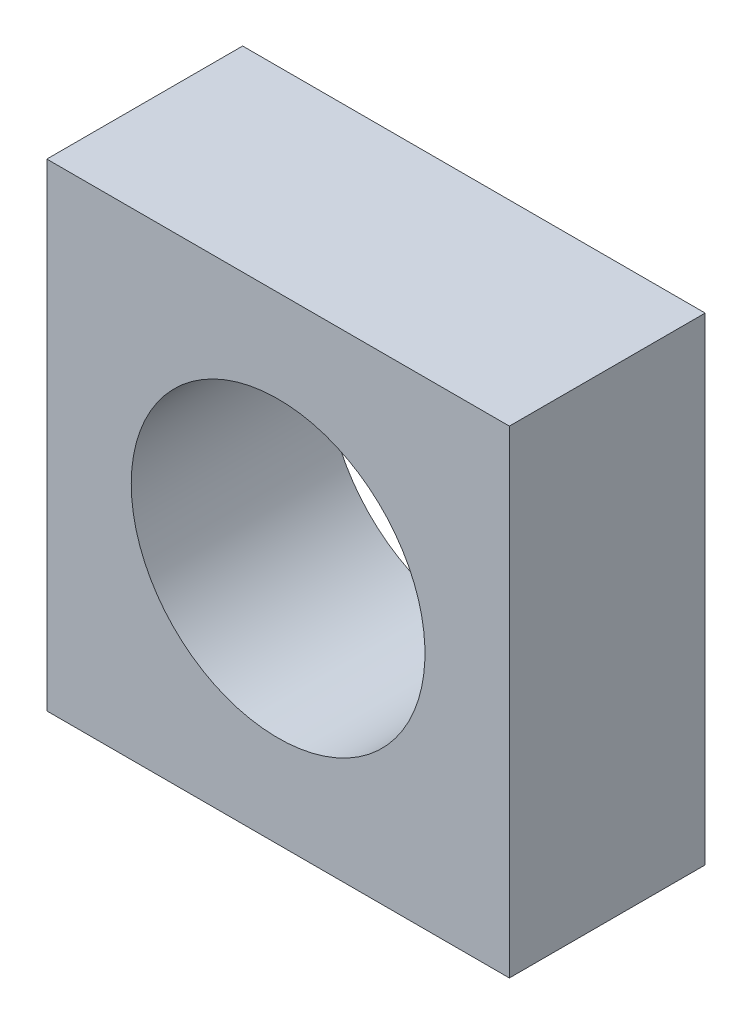
ISO-10303-21;
HEADER;
FILE_DESCRIPTION(('STEP AP214'),'2;1');
FILE_NAME('part.step','',(''),(''),'','','');
FILE_SCHEMA(('AUTOMOTIVE_DESIGN { 1 0 10303 214 1 1 1 1 }'));
ENDSEC;
DATA;
#1=APPLICATION_CONTEXT('core data for automotive mechanical design processes');
#2=APPLICATION_PROTOCOL_DEFINITION('international standard','automotive_design',2000,#1);
#3=PRODUCT_CONTEXT('',#1,'mechanical');
#4=PRODUCT('Part','Part','',(#3));
#5=PRODUCT_RELATED_PRODUCT_CATEGORY('part','',(#4));
#6=PRODUCT_DEFINITION_FORMATION('','',#4);
#7=PRODUCT_DEFINITION_CONTEXT('part definition',#1,'design');
#8=PRODUCT_DEFINITION('design','',#6,#7);
#9=PRODUCT_DEFINITION_SHAPE('','',#8);
#10=(LENGTH_UNIT() NAMED_UNIT(*) SI_UNIT(.MILLI.,.METRE.));
#11=(NAMED_UNIT(*) PLANE_ANGLE_UNIT() SI_UNIT($,.RADIAN.));
#12=(NAMED_UNIT(*) SI_UNIT($,.STERADIAN.) SOLID_ANGLE_UNIT());
#13=UNCERTAINTY_MEASURE_WITH_UNIT(LENGTH_MEASURE(1.E-05),#10,'distance_accuracy_value','');
#14=(GEOMETRIC_REPRESENTATION_CONTEXT(3) GLOBAL_UNCERTAINTY_ASSIGNED_CONTEXT((#13)) GLOBAL_UNIT_ASSIGNED_CONTEXT((#10,
#11,#12)) REPRESENTATION_CONTEXT('',''));
#15=CARTESIAN_POINT('',(0.,0.,0.));
#16=DIRECTION('',(0.,0.,1.));
#17=DIRECTION('',(1.,0.,0.));
#18=AXIS2_PLACEMENT_3D('',#15,#16,#17);
#19=CARTESIAN_POINT('',(0.,0.,0.));
#20=DIRECTION('',(0.,0.,1.));
#21=DIRECTION('',(1.,0.,0.));
#22=AXIS2_PLACEMENT_3D('',#19,#20,#21);
#23=PLANE('',#22);
#24=CARTESIAN_POINT('',(0.,0.,0.));
#25=DIRECTION('',(0.,0.,-1.));
#26=DIRECTION('',(-1.,0.,0.));
#27=AXIS2_PLACEMENT_3D('',#24,#25,#26);
#28=CIRCLE('',#27,19.05);
#29=CARTESIAN_POINT('',(-19.05,0.,0.));
#30=VERTEX_POINT('',#29);
#31=EDGE_CURVE('E20',#30,#30,#28,.F.);
#32=ORIENTED_EDGE('',*,*,#31,.T.);
#33=EDGE_LOOP('',(#32));
#34=FACE_BOUND('',#33,.T.);
#35=DIRECTION('',(1.,0.,0.));
#36=VECTOR('',#35,1.);
#37=CARTESIAN_POINT('',(30.,31.,0.));
#38=LINE('',#37,#36);
#39=CARTESIAN_POINT('',(-30.,31.,0.));
#40=VERTEX_POINT('',#39);
#41=CARTESIAN_POINT('',(30.,31.,0.));
#42=VERTEX_POINT('',#41);
#43=EDGE_CURVE('E83',#40,#42,#38,.T.);
#44=ORIENTED_EDGE('',*,*,#43,.T.);
#45=DIRECTION('',(0.,1.,0.));
#46=VECTOR('',#45,1.);
#47=CARTESIAN_POINT('',(30.,-31.,0.));
#48=LINE('',#47,#46);
#49=CARTESIAN_POINT('',(30.,-31.,0.));
#50=VERTEX_POINT('',#49);
#51=EDGE_CURVE('E69',#42,#50,#48,.F.);
#52=ORIENTED_EDGE('',*,*,#51,.T.);
#53=DIRECTION('',(-1.,0.,0.));
#54=VECTOR('',#53,1.);
#55=CARTESIAN_POINT('',(30.,-31.,0.));
#56=LINE('',#55,#54);
#57=CARTESIAN_POINT('',(-30.,-31.,0.));
#58=VERTEX_POINT('',#57);
#59=EDGE_CURVE('E54',#50,#58,#56,.T.);
#60=ORIENTED_EDGE('',*,*,#59,.T.);
#61=DIRECTION('',(0.,1.,0.));
#62=VECTOR('',#61,1.);
#63=CARTESIAN_POINT('',(-30.,-31.,0.));
#64=LINE('',#63,#62);
#65=EDGE_CURVE('E59',#58,#40,#64,.T.);
#66=ORIENTED_EDGE('',*,*,#65,.T.);
#67=EDGE_LOOP('',(#44,#52,#60,#66));
#68=FACE_BOUND('',#67,.T.);
#69=ADVANCED_FACE('F17',(#34,#68),#23,.F.);
#70=CARTESIAN_POINT('',(-30.,-31.,25.4));
#71=DIRECTION('',(1.,0.,0.));
#72=DIRECTION('',(0.,1.,0.));
#73=AXIS2_PLACEMENT_3D('',#70,#71,#72);
#74=PLANE('',#73);
#75=DIRECTION('',(0.,0.,1.));
#76=VECTOR('',#75,1.);
#77=CARTESIAN_POINT('',(-30.,-31.,25.4));
#78=LINE('',#77,#76);
#79=CARTESIAN_POINT('',(-30.,-31.,25.4));
#80=VERTEX_POINT('',#79);
#81=EDGE_CURVE('E61',#58,#80,#78,.T.);
#82=ORIENTED_EDGE('',*,*,#81,.T.);
#83=DIRECTION('',(0.,1.,0.));
#84=VECTOR('',#83,1.);
#85=CARTESIAN_POINT('',(-30.,0.,25.4));
#86=LINE('',#85,#84);
#87=CARTESIAN_POINT('',(-30.,31.,25.4));
#88=VERTEX_POINT('',#87);
#89=EDGE_CURVE('E85',#88,#80,#86,.F.);
#90=ORIENTED_EDGE('',*,*,#89,.F.);
#91=DIRECTION('',(0.,0.,1.));
#92=VECTOR('',#91,1.);
#93=CARTESIAN_POINT('',(-30.,31.,25.4));
#94=LINE('',#93,#92);
#95=EDGE_CURVE('E64',#88,#40,#94,.F.);
#96=ORIENTED_EDGE('',*,*,#95,.T.);
#97=ORIENTED_EDGE('',*,*,#65,.F.);
#98=EDGE_LOOP('',(#82,#90,#96,#97));
#99=FACE_BOUND('',#98,.T.);
#100=ADVANCED_FACE('F60',(#99),#74,.F.);
#101=CARTESIAN_POINT('',(30.,-31.,25.4));
#102=DIRECTION('',(0.,1.,0.));
#103=DIRECTION('',(-1.,0.,0.));
#104=AXIS2_PLACEMENT_3D('',#101,#102,#103);
#105=PLANE('',#104);
#106=DIRECTION('',(0.,0.,1.));
#107=VECTOR('',#106,1.);
#108=CARTESIAN_POINT('',(30.,-31.,25.4));
#109=LINE('',#108,#107);
#110=CARTESIAN_POINT('',(30.,-31.,25.4));
#111=VERTEX_POINT('',#110);
#112=EDGE_CURVE('E71',#50,#111,#109,.T.);
#113=ORIENTED_EDGE('',*,*,#112,.T.);
#114=DIRECTION('',(1.,0.,0.));
#115=VECTOR('',#114,1.);
#116=CARTESIAN_POINT('',(0.,-31.,25.4));
#117=LINE('',#116,#115);
#118=EDGE_CURVE('E75',#80,#111,#117,.T.);
#119=ORIENTED_EDGE('',*,*,#118,.F.);
#120=ORIENTED_EDGE('',*,*,#81,.F.);
#121=ORIENTED_EDGE('',*,*,#59,.F.);
#122=EDGE_LOOP('',(#113,#119,#120,#121));
#123=FACE_BOUND('',#122,.T.);
#124=ADVANCED_FACE('F73',(#123),#105,.F.);
#125=CARTESIAN_POINT('',(30.,-31.,25.4));
#126=DIRECTION('',(-1.,0.,0.));
#127=DIRECTION('',(0.,0.,1.));
#128=AXIS2_PLACEMENT_3D('',#125,#126,#127);
#129=PLANE('',#128);
#130=DIRECTION('',(0.,0.,1.));
#131=VECTOR('',#130,1.);
#132=CARTESIAN_POINT('',(30.,31.,25.4));
#133=LINE('',#132,#131);
#134=CARTESIAN_POINT('',(30.,31.,25.4));
#135=VERTEX_POINT('',#134);
#136=EDGE_CURVE('E34',#42,#135,#133,.T.);
#137=ORIENTED_EDGE('',*,*,#136,.T.);
#138=DIRECTION('',(0.,1.,0.));
#139=VECTOR('',#138,1.);
#140=CARTESIAN_POINT('',(30.,0.,25.4));
#141=LINE('',#140,#139);
#142=EDGE_CURVE('E88',#111,#135,#141,.T.);
#143=ORIENTED_EDGE('',*,*,#142,.F.);
#144=ORIENTED_EDGE('',*,*,#112,.F.);
#145=ORIENTED_EDGE('',*,*,#51,.F.);
#146=EDGE_LOOP('',(#137,#143,#144,#145));
#147=FACE_BOUND('',#146,.T.);
#148=ADVANCED_FACE('F98',(#147),#129,.F.);
#149=CARTESIAN_POINT('',(30.,31.,25.4));
#150=DIRECTION('',(0.,-1.,0.));
#151=DIRECTION('',(1.,0.,0.));
#152=AXIS2_PLACEMENT_3D('',#149,#150,#151);
#153=PLANE('',#152);
#154=ORIENTED_EDGE('',*,*,#95,.F.);
#155=DIRECTION('',(1.,0.,0.));
#156=VECTOR('',#155,1.);
#157=CARTESIAN_POINT('',(0.,31.,25.4));
#158=LINE('',#157,#156);
#159=EDGE_CURVE('E26',#135,#88,#158,.F.);
#160=ORIENTED_EDGE('',*,*,#159,.F.);
#161=ORIENTED_EDGE('',*,*,#136,.F.);
#162=ORIENTED_EDGE('',*,*,#43,.F.);
#163=EDGE_LOOP('',(#154,#160,#161,#162));
#164=FACE_BOUND('',#163,.T.);
#165=ADVANCED_FACE('F95',(#164),#153,.F.);
#166=CARTESIAN_POINT('',(0.,0.,25.4));
#167=DIRECTION('',(0.,0.,-1.));
#168=DIRECTION('',(-1.,0.,0.));
#169=AXIS2_PLACEMENT_3D('',#166,#167,#168);
#170=CYLINDRICAL_SURFACE('',#169,19.05);
#171=CARTESIAN_POINT('',(0.,0.,25.4));
#172=DIRECTION('',(0.,0.,-1.));
#173=DIRECTION('',(-1.,0.,0.));
#174=AXIS2_PLACEMENT_3D('',#171,#172,#173);
#175=CIRCLE('',#174,19.05);
#176=CARTESIAN_POINT('',(-19.05,0.,25.4));
#177=VERTEX_POINT('',#176);
#178=EDGE_CURVE('E11',#177,#177,#175,.T.);
#179=ORIENTED_EDGE('',*,*,#178,.F.);
#180=EDGE_LOOP('',(#179));
#181=FACE_BOUND('',#180,.T.);
#182=ORIENTED_EDGE('',*,*,#31,.F.);
#183=EDGE_LOOP('',(#182));
#184=FACE_BOUND('',#183,.T.);
#185=ADVANCED_FACE('F97',(#181,#184),#170,.F.);
#186=CARTESIAN_POINT('',(0.,0.,25.4));
#187=DIRECTION('',(0.,0.,1.));
#188=DIRECTION('',(1.,0.,0.));
#189=AXIS2_PLACEMENT_3D('',#186,#187,#188);
#190=PLANE('',#189);
#191=ORIENTED_EDGE('',*,*,#178,.T.);
#192=EDGE_LOOP('',(#191));
#193=FACE_BOUND('',#192,.T.);
#194=ORIENTED_EDGE('',*,*,#142,.T.);
#195=ORIENTED_EDGE('',*,*,#159,.T.);
#196=ORIENTED_EDGE('',*,*,#89,.T.);
#197=ORIENTED_EDGE('',*,*,#118,.T.);
#198=EDGE_LOOP('',(#194,#195,#196,#197));
#199=FACE_BOUND('',#198,.T.);
#200=ADVANCED_FACE('F93',(#193,#199),#190,.T.);
#201=CLOSED_SHELL('',(#69,#100,#124,#148,#165,#185,#200));
#202=MANIFOLD_SOLID_BREP('B1',#201);
#203=ADVANCED_BREP_SHAPE_REPRESENTATION('',(#18,#202),#14);
#204=SHAPE_DEFINITION_REPRESENTATION(#9,#203);
ENDSEC;
END-ISO-10303-21;
